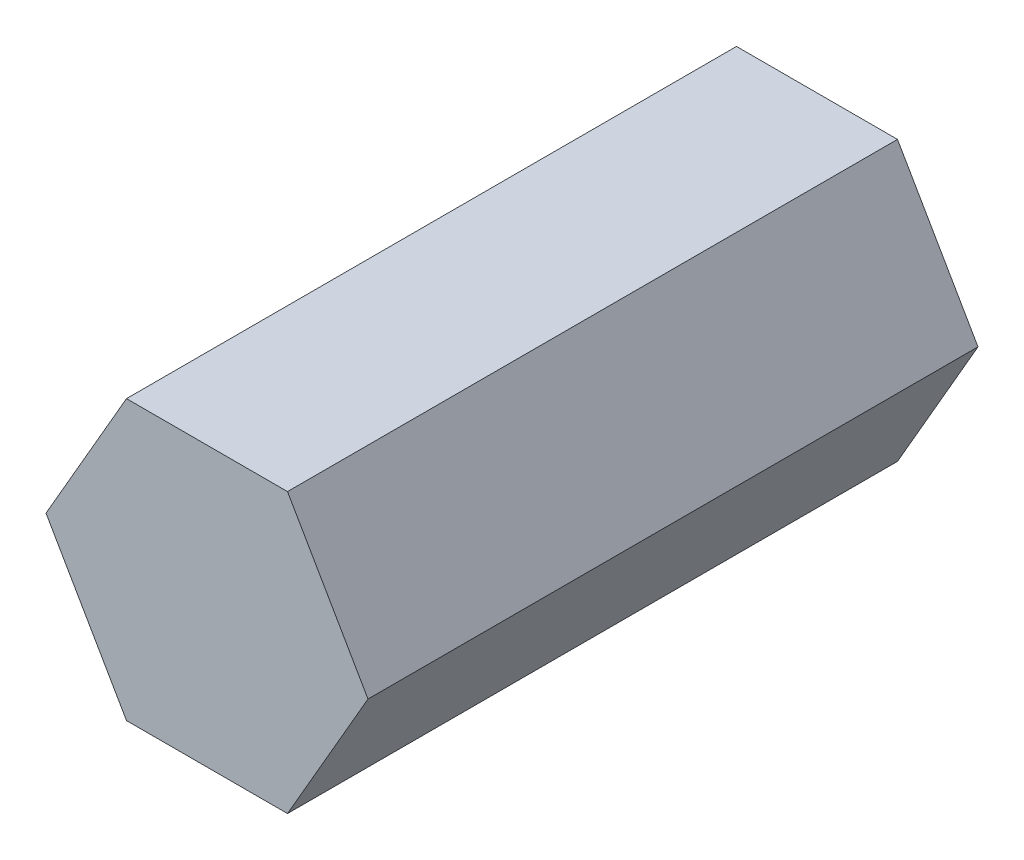
ISO-10303-21;
HEADER;
FILE_DESCRIPTION(('STEP AP214'),'2;1');
FILE_NAME('part.step','',(''),(''),'','','');
FILE_SCHEMA(('AUTOMOTIVE_DESIGN { 1 0 10303 214 1 1 1 1 }'));
ENDSEC;
DATA;
#1=APPLICATION_CONTEXT('core data for automotive mechanical design processes');
#2=APPLICATION_PROTOCOL_DEFINITION('international standard','automotive_design',2000,#1);
#3=PRODUCT_CONTEXT('',#1,'mechanical');
#4=PRODUCT('Part','Part','',(#3));
#5=PRODUCT_RELATED_PRODUCT_CATEGORY('part','',(#4));
#6=PRODUCT_DEFINITION_FORMATION('','',#4);
#7=PRODUCT_DEFINITION_CONTEXT('part definition',#1,'design');
#8=PRODUCT_DEFINITION('design','',#6,#7);
#9=PRODUCT_DEFINITION_SHAPE('','',#8);
#10=(LENGTH_UNIT() NAMED_UNIT(*) SI_UNIT(.MILLI.,.METRE.));
#11=(NAMED_UNIT(*) PLANE_ANGLE_UNIT() SI_UNIT($,.RADIAN.));
#12=(NAMED_UNIT(*) SI_UNIT($,.STERADIAN.) SOLID_ANGLE_UNIT());
#13=UNCERTAINTY_MEASURE_WITH_UNIT(LENGTH_MEASURE(1.E-05),#10,'distance_accuracy_value','');
#14=(GEOMETRIC_REPRESENTATION_CONTEXT(3) GLOBAL_UNCERTAINTY_ASSIGNED_CONTEXT((#13)) GLOBAL_UNIT_ASSIGNED_CONTEXT((#10,
#11,#12)) REPRESENTATION_CONTEXT('',''));
#15=CARTESIAN_POINT('',(0.,0.,0.));
#16=DIRECTION('',(0.,0.,1.));
#17=DIRECTION('',(1.,0.,0.));
#18=AXIS2_PLACEMENT_3D('',#15,#16,#17);
#19=CARTESIAN_POINT('',(-0.923760430703401,-1.6,7.));
#20=DIRECTION('',(0.,1.,0.));
#21=DIRECTION('',(-1.,0.,0.));
#22=AXIS2_PLACEMENT_3D('',#19,#20,#21);
#23=PLANE('',#22);
#24=DIRECTION('',(1.,0.,0.));
#25=VECTOR('',#24,1.);
#26=CARTESIAN_POINT('',(-0.923760430703401,-1.6,0.));
#27=LINE('',#26,#25);
#28=CARTESIAN_POINT('',(-0.923760430703401,-1.6,0.));
#29=VERTEX_POINT('',#28);
#30=CARTESIAN_POINT('',(0.923760430703402,-1.6,0.));
#31=VERTEX_POINT('',#30);
#32=EDGE_CURVE('E123',#29,#31,#27,.T.);
#33=ORIENTED_EDGE('',*,*,#32,.T.);
#34=DIRECTION('',(0.,0.,-1.));
#35=VECTOR('',#34,1.);
#36=CARTESIAN_POINT('',(0.923760430703402,-1.6,7.));
#37=LINE('',#36,#35);
#38=CARTESIAN_POINT('',(0.923760430703402,-1.6,7.));
#39=VERTEX_POINT('',#38);
#40=EDGE_CURVE('E11',#39,#31,#37,.T.);
#41=ORIENTED_EDGE('',*,*,#40,.F.);
#42=DIRECTION('',(1.,0.,0.));
#43=VECTOR('',#42,1.);
#44=CARTESIAN_POINT('',(-0.923760430703401,-1.6,7.));
#45=LINE('',#44,#43);
#46=CARTESIAN_POINT('',(-0.923760430703401,-1.6,7.));
#47=VERTEX_POINT('',#46);
#48=EDGE_CURVE('E134',#47,#39,#45,.T.);
#49=ORIENTED_EDGE('',*,*,#48,.F.);
#50=DIRECTION('',(0.,0.,-1.));
#51=VECTOR('',#50,1.);
#52=CARTESIAN_POINT('',(-0.923760430703401,-1.6,7.));
#53=LINE('',#52,#51);
#54=EDGE_CURVE('E119',#47,#29,#53,.T.);
#55=ORIENTED_EDGE('',*,*,#54,.T.);
#56=EDGE_LOOP('',(#33,#41,#49,#55));
#57=FACE_BOUND('',#56,.T.);
#58=ADVANCED_FACE('F37',(#57),#23,.F.);
#59=CARTESIAN_POINT('',(0.923760430703402,-1.6,7.));
#60=DIRECTION('',(-0.866025403784439,0.5,0.));
#61=DIRECTION('',(-0.5,-0.866025403784439,0.));
#62=AXIS2_PLACEMENT_3D('',#59,#60,#61);
#63=PLANE('',#62);
#64=DIRECTION('',(0.5,0.866025403784439,0.));
#65=VECTOR('',#64,1.);
#66=CARTESIAN_POINT('',(0.923760430703402,-1.6,0.));
#67=LINE('',#66,#65);
#68=CARTESIAN_POINT('',(1.8475208614068,0.,0.));
#69=VERTEX_POINT('',#68);
#70=EDGE_CURVE('E126',#31,#69,#67,.T.);
#71=ORIENTED_EDGE('',*,*,#70,.T.);
#72=DIRECTION('',(0.,0.,-1.));
#73=VECTOR('',#72,1.);
#74=CARTESIAN_POINT('',(1.8475208614068,0.,7.));
#75=LINE('',#74,#73);
#76=CARTESIAN_POINT('',(1.8475208614068,0.,7.));
#77=VERTEX_POINT('',#76);
#78=EDGE_CURVE('E45',#77,#69,#75,.T.);
#79=ORIENTED_EDGE('',*,*,#78,.F.);
#80=DIRECTION('',(0.5,0.866025403784439,0.));
#81=VECTOR('',#80,1.);
#82=CARTESIAN_POINT('',(0.923760430703402,-1.6,7.));
#83=LINE('',#82,#81);
#84=EDGE_CURVE('E91',#39,#77,#83,.T.);
#85=ORIENTED_EDGE('',*,*,#84,.F.);
#86=ORIENTED_EDGE('',*,*,#40,.T.);
#87=EDGE_LOOP('',(#71,#79,#85,#86));
#88=FACE_BOUND('',#87,.T.);
#89=ADVANCED_FACE('F158',(#88),#63,.F.);
#90=CARTESIAN_POINT('',(1.8475208614068,0.,7.));
#91=DIRECTION('',(-0.866025403784438,-0.5,0.));
#92=DIRECTION('',(0.5,-0.866025403784439,0.));
#93=AXIS2_PLACEMENT_3D('',#90,#91,#92);
#94=PLANE('',#93);
#95=DIRECTION('',(-0.5,0.866025403784439,0.));
#96=VECTOR('',#95,1.);
#97=CARTESIAN_POINT('',(1.8475208614068,0.,0.));
#98=LINE('',#97,#96);
#99=CARTESIAN_POINT('',(0.923760430703402,1.6,0.));
#100=VERTEX_POINT('',#99);
#101=EDGE_CURVE('E129',#69,#100,#98,.T.);
#102=ORIENTED_EDGE('',*,*,#101,.T.);
#103=DIRECTION('',(0.,0.,-1.));
#104=VECTOR('',#103,1.);
#105=CARTESIAN_POINT('',(0.923760430703402,1.6,7.));
#106=LINE('',#105,#104);
#107=CARTESIAN_POINT('',(0.923760430703402,1.6,7.));
#108=VERTEX_POINT('',#107);
#109=EDGE_CURVE('E114',#108,#100,#106,.T.);
#110=ORIENTED_EDGE('',*,*,#109,.F.);
#111=DIRECTION('',(-0.5,0.866025403784439,0.));
#112=VECTOR('',#111,1.);
#113=CARTESIAN_POINT('',(1.8475208614068,0.,7.));
#114=LINE('',#113,#112);
#115=EDGE_CURVE('E105',#77,#108,#114,.T.);
#116=ORIENTED_EDGE('',*,*,#115,.F.);
#117=ORIENTED_EDGE('',*,*,#78,.T.);
#118=EDGE_LOOP('',(#102,#110,#116,#117));
#119=FACE_BOUND('',#118,.T.);
#120=ADVANCED_FACE('F140',(#119),#94,.F.);
#121=CARTESIAN_POINT('',(0.923760430703402,1.6,7.));
#122=DIRECTION('',(0.,-1.,0.));
#123=DIRECTION('',(1.,0.,0.));
#124=AXIS2_PLACEMENT_3D('',#121,#122,#123);
#125=PLANE('',#124);
#126=DIRECTION('',(-1.,0.,0.));
#127=VECTOR('',#126,1.);
#128=CARTESIAN_POINT('',(0.923760430703402,1.6,0.));
#129=LINE('',#128,#127);
#130=CARTESIAN_POINT('',(-0.923760430703402,1.6,0.));
#131=VERTEX_POINT('',#130);
#132=EDGE_CURVE('E113',#100,#131,#129,.T.);
#133=ORIENTED_EDGE('',*,*,#132,.T.);
#134=DIRECTION('',(0.,0.,-1.));
#135=VECTOR('',#134,1.);
#136=CARTESIAN_POINT('',(-0.923760430703402,1.6,7.));
#137=LINE('',#136,#135);
#138=CARTESIAN_POINT('',(-0.923760430703402,1.6,7.));
#139=VERTEX_POINT('',#138);
#140=EDGE_CURVE('E110',#139,#131,#137,.T.);
#141=ORIENTED_EDGE('',*,*,#140,.F.);
#142=DIRECTION('',(-1.,0.,0.));
#143=VECTOR('',#142,1.);
#144=CARTESIAN_POINT('',(0.923760430703402,1.6,7.));
#145=LINE('',#144,#143);
#146=EDGE_CURVE('E99',#108,#139,#145,.T.);
#147=ORIENTED_EDGE('',*,*,#146,.F.);
#148=ORIENTED_EDGE('',*,*,#109,.T.);
#149=EDGE_LOOP('',(#133,#141,#147,#148));
#150=FACE_BOUND('',#149,.T.);
#151=ADVANCED_FACE('F111',(#150),#125,.F.);
#152=CARTESIAN_POINT('',(-0.923760430703402,1.6,7.));
#153=DIRECTION('',(0.866025403784439,-0.5,0.));
#154=DIRECTION('',(0.5,0.866025403784439,0.));
#155=AXIS2_PLACEMENT_3D('',#152,#153,#154);
#156=PLANE('',#155);
#157=DIRECTION('',(-0.5,-0.866025403784439,0.));
#158=VECTOR('',#157,1.);
#159=CARTESIAN_POINT('',(-0.923760430703402,1.6,0.));
#160=LINE('',#159,#158);
#161=CARTESIAN_POINT('',(-1.8475208614068,0.,0.));
#162=VERTEX_POINT('',#161);
#163=EDGE_CURVE('E77',#131,#162,#160,.T.);
#164=ORIENTED_EDGE('',*,*,#163,.T.);
#165=DIRECTION('',(0.,0.,-1.));
#166=VECTOR('',#165,1.);
#167=CARTESIAN_POINT('',(-1.8475208614068,0.,7.));
#168=LINE('',#167,#166);
#169=CARTESIAN_POINT('',(-1.8475208614068,0.,7.));
#170=VERTEX_POINT('',#169);
#171=EDGE_CURVE('E115',#170,#162,#168,.T.);
#172=ORIENTED_EDGE('',*,*,#171,.F.);
#173=DIRECTION('',(-0.5,-0.866025403784439,0.));
#174=VECTOR('',#173,1.);
#175=CARTESIAN_POINT('',(-0.923760430703402,1.6,7.));
#176=LINE('',#175,#174);
#177=EDGE_CURVE('E103',#139,#170,#176,.T.);
#178=ORIENTED_EDGE('',*,*,#177,.F.);
#179=ORIENTED_EDGE('',*,*,#140,.T.);
#180=EDGE_LOOP('',(#164,#172,#178,#179));
#181=FACE_BOUND('',#180,.T.);
#182=ADVANCED_FACE('F117',(#181),#156,.F.);
#183=CARTESIAN_POINT('',(-1.8475208614068,0.,7.));
#184=DIRECTION('',(0.866025403784439,0.5,0.));
#185=DIRECTION('',(-0.5,0.866025403784439,0.));
#186=AXIS2_PLACEMENT_3D('',#183,#184,#185);
#187=PLANE('',#186);
#188=DIRECTION('',(0.5,-0.866025403784439,0.));
#189=VECTOR('',#188,1.);
#190=CARTESIAN_POINT('',(-1.8475208614068,0.,0.));
#191=LINE('',#190,#189);
#192=EDGE_CURVE('E83',#162,#29,#191,.T.);
#193=ORIENTED_EDGE('',*,*,#192,.T.);
#194=ORIENTED_EDGE('',*,*,#54,.F.);
#195=DIRECTION('',(0.5,-0.866025403784439,0.));
#196=VECTOR('',#195,1.);
#197=CARTESIAN_POINT('',(-1.8475208614068,0.,7.));
#198=LINE('',#197,#196);
#199=EDGE_CURVE('E53',#170,#47,#198,.T.);
#200=ORIENTED_EDGE('',*,*,#199,.F.);
#201=ORIENTED_EDGE('',*,*,#171,.T.);
#202=EDGE_LOOP('',(#193,#194,#200,#201));
#203=FACE_BOUND('',#202,.T.);
#204=ADVANCED_FACE('F147',(#203),#187,.F.);
#205=CARTESIAN_POINT('',(-2.7712812921102,-1.6,7.));
#206=DIRECTION('',(0.,0.,-1.));
#207=DIRECTION('',(-1.,0.,0.));
#208=AXIS2_PLACEMENT_3D('',#205,#206,#207);
#209=PLANE('',#208);
#210=ORIENTED_EDGE('',*,*,#48,.T.);
#211=ORIENTED_EDGE('',*,*,#84,.T.);
#212=ORIENTED_EDGE('',*,*,#115,.T.);
#213=ORIENTED_EDGE('',*,*,#146,.T.);
#214=ORIENTED_EDGE('',*,*,#177,.T.);
#215=ORIENTED_EDGE('',*,*,#199,.T.);
#216=EDGE_LOOP('',(#210,#211,#212,#213,#214,#215));
#217=FACE_BOUND('',#216,.T.);
#218=ADVANCED_FACE('F101',(#217),#209,.F.);
#219=CARTESIAN_POINT('',(-2.7712812921102,-1.6,0.));
#220=DIRECTION('',(0.,0.,-1.));
#221=DIRECTION('',(-1.,0.,0.));
#222=AXIS2_PLACEMENT_3D('',#219,#220,#221);
#223=PLANE('',#222);
#224=CARTESIAN_POINT('',(0.,0.,0.));
#225=DIRECTION('',(0.,0.,-1.));
#226=DIRECTION('',(-1.,0.,0.));
#227=AXIS2_PLACEMENT_3D('',#224,#225,#226);
#228=CIRCLE('',#227,0.799999999999999);
#229=CARTESIAN_POINT('',(-0.799999999999999,0.,0.));
#230=VERTEX_POINT('',#229);
#231=EDGE_CURVE('E127',#230,#230,#228,.T.);
#232=ORIENTED_EDGE('',*,*,#231,.F.);
#233=EDGE_LOOP('',(#232));
#234=FACE_BOUND('',#233,.T.);
#235=ORIENTED_EDGE('',*,*,#32,.F.);
#236=ORIENTED_EDGE('',*,*,#192,.F.);
#237=ORIENTED_EDGE('',*,*,#163,.F.);
#238=ORIENTED_EDGE('',*,*,#132,.F.);
#239=ORIENTED_EDGE('',*,*,#101,.F.);
#240=ORIENTED_EDGE('',*,*,#70,.F.);
#241=EDGE_LOOP('',(#235,#236,#237,#238,#239,#240));
#242=FACE_BOUND('',#241,.T.);
#243=ADVANCED_FACE('F143',(#234,#242),#223,.T.);
#244=CARTESIAN_POINT('',(0.,0.,0.));
#245=DIRECTION('',(0.,0.,-1.));
#246=DIRECTION('',(-1.,0.,0.));
#247=AXIS2_PLACEMENT_3D('',#244,#245,#246);
#248=CYLINDRICAL_SURFACE('',#247,0.799999999999999);
#249=CARTESIAN_POINT('',(0.,0.,6.));
#250=DIRECTION('',(0.,0.,-1.));
#251=DIRECTION('',(-1.,0.,0.));
#252=AXIS2_PLACEMENT_3D('',#249,#250,#251);
#253=CIRCLE('',#252,0.799999999999998);
#254=CARTESIAN_POINT('',(-0.799999999999998,0.,6.));
#255=VERTEX_POINT('',#254);
#256=EDGE_CURVE('E226',#255,#255,#253,.T.);
#257=ORIENTED_EDGE('',*,*,#256,.F.);
#258=EDGE_LOOP('',(#257));
#259=FACE_BOUND('',#258,.T.);
#260=ORIENTED_EDGE('',*,*,#231,.T.);
#261=EDGE_LOOP('',(#260));
#262=FACE_BOUND('',#261,.T.);
#263=ADVANCED_FACE('F195',(#259,#262),#248,.F.);
#264=CARTESIAN_POINT('',(0.,0.,6.));
#265=DIRECTION('',(0.,0.,-1.));
#266=DIRECTION('',(-1.,0.,0.));
#267=AXIS2_PLACEMENT_3D('',#264,#265,#266);
#268=CONICAL_SURFACE('',#267,0.799999999999998,1.02974425867665);
#269=CARTESIAN_POINT('',(0.,0.,6.48068849522205));
#270=VERTEX_POINT('',#269);
#271=VERTEX_LOOP('',#270);
#272=FACE_BOUND('',#271,.T.);
#273=ORIENTED_EDGE('',*,*,#256,.T.);
#274=EDGE_LOOP('',(#273));
#275=FACE_BOUND('',#274,.T.);
#276=ADVANCED_FACE('F205',(#272,#275),#268,.F.);
#277=CLOSED_SHELL('',(#58,#89,#120,#151,#182,#204,#218,#243,#263,#276));
#278=MANIFOLD_SOLID_BREP('B2',#277);
#279=ADVANCED_BREP_SHAPE_REPRESENTATION('',(#18,#278),#14);
#280=SHAPE_DEFINITION_REPRESENTATION(#9,#279);
ENDSEC;
END-ISO-10303-21;
